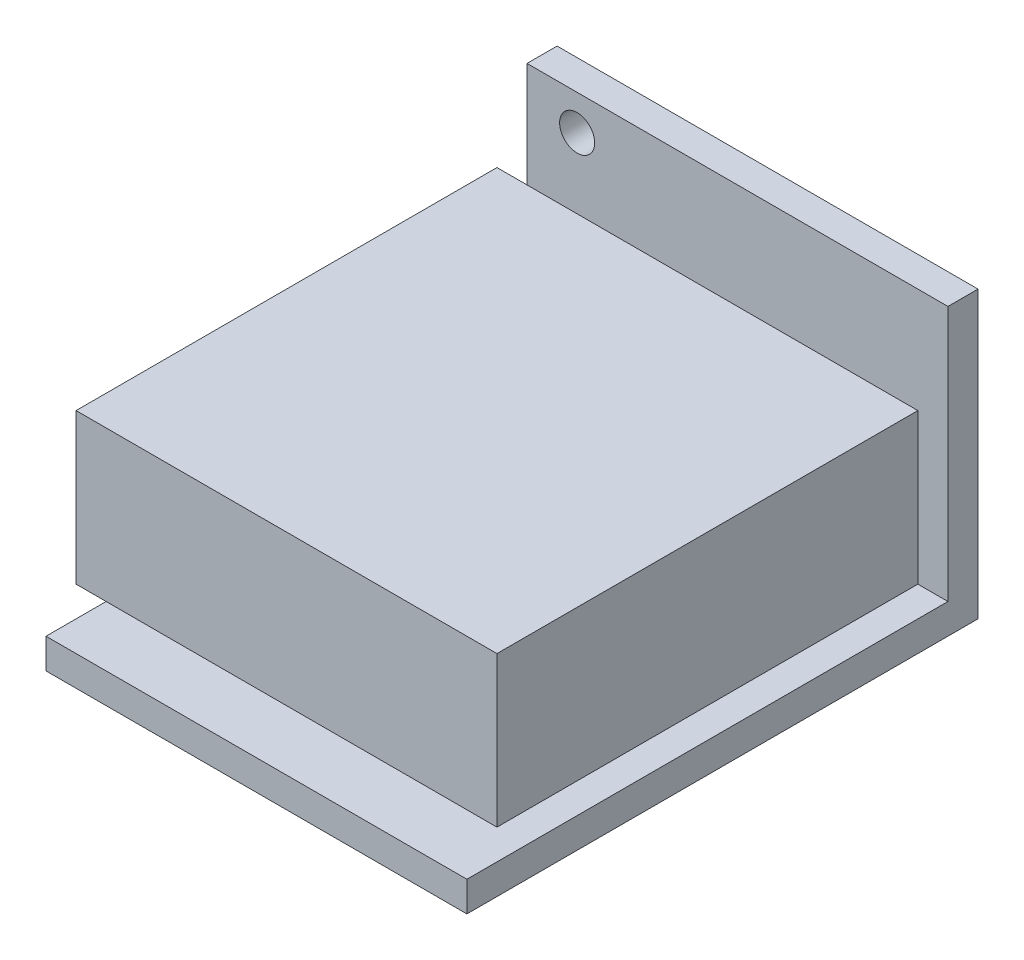
ISO-10303-21;
HEADER;
FILE_DESCRIPTION(('STEP AP214'),'2;1');
FILE_NAME('part.step','',(''),(''),'','','');
FILE_SCHEMA(('AUTOMOTIVE_DESIGN { 1 0 10303 214 1 1 1 1 }'));
ENDSEC;
DATA;
#1=APPLICATION_CONTEXT('core data for automotive mechanical design processes');
#2=APPLICATION_PROTOCOL_DEFINITION('international standard','automotive_design',2000,#1);
#3=PRODUCT_CONTEXT('',#1,'mechanical');
#4=PRODUCT('Part','Part','',(#3));
#5=PRODUCT_RELATED_PRODUCT_CATEGORY('part','',(#4));
#6=PRODUCT_DEFINITION_FORMATION('','',#4);
#7=PRODUCT_DEFINITION_CONTEXT('part definition',#1,'design');
#8=PRODUCT_DEFINITION('design','',#6,#7);
#9=PRODUCT_DEFINITION_SHAPE('','',#8);
#10=(LENGTH_UNIT() NAMED_UNIT(*) SI_UNIT(.MILLI.,.METRE.));
#11=(NAMED_UNIT(*) PLANE_ANGLE_UNIT() SI_UNIT($,.RADIAN.));
#12=(NAMED_UNIT(*) SI_UNIT($,.STERADIAN.) SOLID_ANGLE_UNIT());
#13=UNCERTAINTY_MEASURE_WITH_UNIT(LENGTH_MEASURE(1.E-05),#10,'distance_accuracy_value','');
#14=(GEOMETRIC_REPRESENTATION_CONTEXT(3) GLOBAL_UNCERTAINTY_ASSIGNED_CONTEXT((#13)) GLOBAL_UNIT_ASSIGNED_CONTEXT((#10,
#11,#12)) REPRESENTATION_CONTEXT('',''));
#15=CARTESIAN_POINT('',(0.,0.,0.));
#16=DIRECTION('',(0.,0.,1.));
#17=DIRECTION('',(1.,0.,0.));
#18=AXIS2_PLACEMENT_3D('',#15,#16,#17);
#19=CARTESIAN_POINT('',(-21.,-3.,24.));
#20=DIRECTION('',(0.,1.,0.));
#21=DIRECTION('',(0.,0.,1.));
#22=AXIS2_PLACEMENT_3D('',#19,#20,#21);
#23=PLANE('',#22);
#24=DIRECTION('',(0.,0.,1.));
#25=VECTOR('',#24,1.);
#26=CARTESIAN_POINT('',(21.,-3.,24.));
#27=LINE('',#26,#25);
#28=CARTESIAN_POINT('',(21.,-3.,-24.));
#29=VERTEX_POINT('',#28);
#30=CARTESIAN_POINT('',(21.,-3.,24.));
#31=VERTEX_POINT('',#30);
#32=EDGE_CURVE('E139',#29,#31,#27,.T.);
#33=ORIENTED_EDGE('',*,*,#32,.F.);
#34=DIRECTION('',(1.,0.,0.));
#35=VECTOR('',#34,1.);
#36=CARTESIAN_POINT('',(-21.,-3.,-24.));
#37=LINE('',#36,#35);
#38=CARTESIAN_POINT('',(-21.,-3.,-24.));
#39=VERTEX_POINT('',#38);
#40=EDGE_CURVE('E12',#39,#29,#37,.T.);
#41=ORIENTED_EDGE('',*,*,#40,.F.);
#42=DIRECTION('',(0.,0.,1.));
#43=VECTOR('',#42,1.);
#44=CARTESIAN_POINT('',(-21.,-3.,24.));
#45=LINE('',#44,#43);
#46=CARTESIAN_POINT('',(-21.,-3.,24.));
#47=VERTEX_POINT('',#46);
#48=EDGE_CURVE('E154',#39,#47,#45,.T.);
#49=ORIENTED_EDGE('',*,*,#48,.T.);
#50=DIRECTION('',(1.,0.,0.));
#51=VECTOR('',#50,1.);
#52=CARTESIAN_POINT('',(-21.,-3.,24.));
#53=LINE('',#52,#51);
#54=EDGE_CURVE('E59',#47,#31,#53,.T.);
#55=ORIENTED_EDGE('',*,*,#54,.T.);
#56=EDGE_LOOP('',(#33,#41,#49,#55));
#57=FACE_BOUND('',#56,.T.);
#58=ADVANCED_FACE('F54',(#57),#23,.T.);
#59=CARTESIAN_POINT('',(-21.,-3.,-24.));
#60=DIRECTION('',(0.,0.,1.));
#61=DIRECTION('',(0.,-1.,0.));
#62=AXIS2_PLACEMENT_3D('',#59,#60,#61);
#63=PLANE('',#62);
#64=CARTESIAN_POINT('',(-16.,19.,-24.));
#65=DIRECTION('',(0.,0.,1.));
#66=DIRECTION('',(1.,0.,0.));
#67=AXIS2_PLACEMENT_3D('',#64,#65,#66);
#68=CIRCLE('',#67,1.75);
#69=CARTESIAN_POINT('',(-14.25,19.,-24.));
#70=VERTEX_POINT('',#69);
#71=EDGE_CURVE('E200',#70,#70,#68,.T.);
#72=ORIENTED_EDGE('',*,*,#71,.F.);
#73=EDGE_LOOP('',(#72));
#74=FACE_BOUND('',#73,.T.);
#75=DIRECTION('',(0.,-1.,0.));
#76=VECTOR('',#75,1.);
#77=CARTESIAN_POINT('',(21.,-3.,-24.));
#78=LINE('',#77,#76);
#79=CARTESIAN_POINT('',(21.,22.5,-24.));
#80=VERTEX_POINT('',#79);
#81=EDGE_CURVE('E153',#80,#29,#78,.T.);
#82=ORIENTED_EDGE('',*,*,#81,.F.);
#83=DIRECTION('',(1.,0.,0.));
#84=VECTOR('',#83,1.);
#85=CARTESIAN_POINT('',(-21.,22.5,-24.));
#86=LINE('',#85,#84);
#87=CARTESIAN_POINT('',(-21.,22.5,-24.));
#88=VERTEX_POINT('',#87);
#89=EDGE_CURVE('E63',#88,#80,#86,.T.);
#90=ORIENTED_EDGE('',*,*,#89,.F.);
#91=DIRECTION('',(0.,-1.,0.));
#92=VECTOR('',#91,1.);
#93=CARTESIAN_POINT('',(-21.,-3.,-24.));
#94=LINE('',#93,#92);
#95=EDGE_CURVE('E128',#88,#39,#94,.T.);
#96=ORIENTED_EDGE('',*,*,#95,.T.);
#97=ORIENTED_EDGE('',*,*,#40,.T.);
#98=EDGE_LOOP('',(#82,#90,#96,#97));
#99=FACE_BOUND('',#98,.T.);
#100=ADVANCED_FACE('F162',(#74,#99),#63,.T.);
#101=CARTESIAN_POINT('',(-21.,22.5,-27.));
#102=DIRECTION('',(0.,1.,0.));
#103=DIRECTION('',(0.,0.,1.));
#104=AXIS2_PLACEMENT_3D('',#101,#102,#103);
#105=PLANE('',#104);
#106=DIRECTION('',(0.,0.,1.));
#107=VECTOR('',#106,1.);
#108=CARTESIAN_POINT('',(21.,22.5,-27.));
#109=LINE('',#108,#107);
#110=CARTESIAN_POINT('',(21.,22.5,-27.));
#111=VERTEX_POINT('',#110);
#112=EDGE_CURVE('E120',#111,#80,#109,.T.);
#113=ORIENTED_EDGE('',*,*,#112,.F.);
#114=DIRECTION('',(1.,0.,0.));
#115=VECTOR('',#114,1.);
#116=CARTESIAN_POINT('',(-21.,22.5,-27.));
#117=LINE('',#116,#115);
#118=CARTESIAN_POINT('',(-21.,22.5,-27.));
#119=VERTEX_POINT('',#118);
#120=EDGE_CURVE('E115',#119,#111,#117,.T.);
#121=ORIENTED_EDGE('',*,*,#120,.F.);
#122=DIRECTION('',(0.,0.,1.));
#123=VECTOR('',#122,1.);
#124=CARTESIAN_POINT('',(-21.,22.5,-27.));
#125=LINE('',#124,#123);
#126=EDGE_CURVE('E113',#119,#88,#125,.T.);
#127=ORIENTED_EDGE('',*,*,#126,.T.);
#128=ORIENTED_EDGE('',*,*,#89,.T.);
#129=EDGE_LOOP('',(#113,#121,#127,#128));
#130=FACE_BOUND('',#129,.T.);
#131=ADVANCED_FACE('F111',(#130),#105,.T.);
#132=CARTESIAN_POINT('',(-21.,22.5,-27.));
#133=DIRECTION('',(0.,0.,-1.));
#134=DIRECTION('',(-1.,0.,0.));
#135=AXIS2_PLACEMENT_3D('',#132,#133,#134);
#136=PLANE('',#135);
#137=CARTESIAN_POINT('',(-16.,19.,-27.));
#138=DIRECTION('',(0.,0.,1.));
#139=DIRECTION('',(1.,0.,0.));
#140=AXIS2_PLACEMENT_3D('',#137,#138,#139);
#141=CIRCLE('',#140,1.75);
#142=CARTESIAN_POINT('',(-14.25,19.,-27.));
#143=VERTEX_POINT('',#142);
#144=EDGE_CURVE('E145',#143,#143,#141,.T.);
#145=ORIENTED_EDGE('',*,*,#144,.T.);
#146=EDGE_LOOP('',(#145));
#147=FACE_BOUND('',#146,.T.);
#148=DIRECTION('',(0.,1.,0.));
#149=VECTOR('',#148,1.);
#150=CARTESIAN_POINT('',(21.,22.5,-27.));
#151=LINE('',#150,#149);
#152=CARTESIAN_POINT('',(21.,-6.,-27.));
#153=VERTEX_POINT('',#152);
#154=EDGE_CURVE('E147',#153,#111,#151,.T.);
#155=ORIENTED_EDGE('',*,*,#154,.F.);
#156=DIRECTION('',(1.,0.,0.));
#157=VECTOR('',#156,1.);
#158=CARTESIAN_POINT('',(-21.,-6.,-27.));
#159=LINE('',#158,#157);
#160=CARTESIAN_POINT('',(-21.,-6.,-27.));
#161=VERTEX_POINT('',#160);
#162=EDGE_CURVE('E125',#161,#153,#159,.T.);
#163=ORIENTED_EDGE('',*,*,#162,.F.);
#164=DIRECTION('',(0.,1.,0.));
#165=VECTOR('',#164,1.);
#166=CARTESIAN_POINT('',(-21.,22.5,-27.));
#167=LINE('',#166,#165);
#168=EDGE_CURVE('E126',#161,#119,#167,.T.);
#169=ORIENTED_EDGE('',*,*,#168,.T.);
#170=ORIENTED_EDGE('',*,*,#120,.T.);
#171=EDGE_LOOP('',(#155,#163,#169,#170));
#172=FACE_BOUND('',#171,.T.);
#173=ADVANCED_FACE('F135',(#147,#172),#136,.T.);
#174=CARTESIAN_POINT('',(-21.,-6.,24.));
#175=DIRECTION('',(0.,-1.,0.));
#176=DIRECTION('',(0.,0.,-1.));
#177=AXIS2_PLACEMENT_3D('',#174,#175,#176);
#178=PLANE('',#177);
#179=DIRECTION('',(0.,0.,-1.));
#180=VECTOR('',#179,1.);
#181=CARTESIAN_POINT('',(21.,-6.,24.));
#182=LINE('',#181,#180);
#183=CARTESIAN_POINT('',(21.,-6.,24.));
#184=VERTEX_POINT('',#183);
#185=EDGE_CURVE('E150',#184,#153,#182,.T.);
#186=ORIENTED_EDGE('',*,*,#185,.F.);
#187=DIRECTION('',(1.,0.,0.));
#188=VECTOR('',#187,1.);
#189=CARTESIAN_POINT('',(-21.,-6.,24.));
#190=LINE('',#189,#188);
#191=CARTESIAN_POINT('',(-21.,-6.,24.));
#192=VERTEX_POINT('',#191);
#193=EDGE_CURVE('E158',#192,#184,#190,.T.);
#194=ORIENTED_EDGE('',*,*,#193,.F.);
#195=DIRECTION('',(0.,0.,-1.));
#196=VECTOR('',#195,1.);
#197=CARTESIAN_POINT('',(-21.,-6.,24.));
#198=LINE('',#197,#196);
#199=EDGE_CURVE('E132',#192,#161,#198,.T.);
#200=ORIENTED_EDGE('',*,*,#199,.T.);
#201=ORIENTED_EDGE('',*,*,#162,.T.);
#202=EDGE_LOOP('',(#186,#194,#200,#201));
#203=FACE_BOUND('',#202,.T.);
#204=ADVANCED_FACE('F177',(#203),#178,.T.);
#205=CARTESIAN_POINT('',(-21.,-3.,24.));
#206=DIRECTION('',(0.,0.,1.));
#207=DIRECTION('',(1.,0.,0.));
#208=AXIS2_PLACEMENT_3D('',#205,#206,#207);
#209=PLANE('',#208);
#210=DIRECTION('',(0.,-1.,0.));
#211=VECTOR('',#210,1.);
#212=CARTESIAN_POINT('',(21.,-3.,24.));
#213=LINE('',#212,#211);
#214=EDGE_CURVE('E141',#31,#184,#213,.T.);
#215=ORIENTED_EDGE('',*,*,#214,.F.);
#216=ORIENTED_EDGE('',*,*,#54,.F.);
#217=DIRECTION('',(0.,-1.,0.));
#218=VECTOR('',#217,1.);
#219=CARTESIAN_POINT('',(-21.,-3.,24.));
#220=LINE('',#219,#218);
#221=EDGE_CURVE('E134',#47,#192,#220,.T.);
#222=ORIENTED_EDGE('',*,*,#221,.T.);
#223=ORIENTED_EDGE('',*,*,#193,.T.);
#224=EDGE_LOOP('',(#215,#216,#222,#223));
#225=FACE_BOUND('',#224,.T.);
#226=ADVANCED_FACE('F159',(#225),#209,.T.);
#227=CARTESIAN_POINT('',(-21.,0.,0.));
#228=DIRECTION('',(1.,0.,0.));
#229=DIRECTION('',(0.,0.,-1.));
#230=AXIS2_PLACEMENT_3D('',#227,#228,#229);
#231=PLANE('',#230);
#232=ORIENTED_EDGE('',*,*,#48,.F.);
#233=ORIENTED_EDGE('',*,*,#95,.F.);
#234=ORIENTED_EDGE('',*,*,#126,.F.);
#235=ORIENTED_EDGE('',*,*,#168,.F.);
#236=ORIENTED_EDGE('',*,*,#199,.F.);
#237=ORIENTED_EDGE('',*,*,#221,.F.);
#238=EDGE_LOOP('',(#232,#233,#234,#235,#236,#237));
#239=FACE_BOUND('',#238,.T.);
#240=ADVANCED_FACE('F127',(#239),#231,.F.);
#241=CARTESIAN_POINT('',(21.,0.,0.));
#242=DIRECTION('',(1.,0.,0.));
#243=DIRECTION('',(0.,0.,-1.));
#244=AXIS2_PLACEMENT_3D('',#241,#242,#243);
#245=PLANE('',#244);
#246=ORIENTED_EDGE('',*,*,#32,.T.);
#247=ORIENTED_EDGE('',*,*,#214,.T.);
#248=ORIENTED_EDGE('',*,*,#185,.T.);
#249=ORIENTED_EDGE('',*,*,#154,.T.);
#250=ORIENTED_EDGE('',*,*,#112,.T.);
#251=ORIENTED_EDGE('',*,*,#81,.T.);
#252=EDGE_LOOP('',(#246,#247,#248,#249,#250,#251));
#253=FACE_BOUND('',#252,.T.);
#254=ADVANCED_FACE('F165',(#253),#245,.T.);
#255=CARTESIAN_POINT('',(-16.,19.,-27.));
#256=DIRECTION('',(0.,0.,1.));
#257=DIRECTION('',(1.,0.,0.));
#258=AXIS2_PLACEMENT_3D('',#255,#256,#257);
#259=CYLINDRICAL_SURFACE('',#258,1.75);
#260=ORIENTED_EDGE('',*,*,#144,.F.);
#261=EDGE_LOOP('',(#260));
#262=FACE_BOUND('',#261,.T.);
#263=ORIENTED_EDGE('',*,*,#71,.T.);
#264=EDGE_LOOP('',(#263));
#265=FACE_BOUND('',#264,.T.);
#266=ADVANCED_FACE('F188',(#262,#265),#259,.F.);
#267=CLOSED_SHELL('',(#58,#100,#131,#173,#204,#226,#240,#254,#266));
#268=MANIFOLD_SOLID_BREP('B2',#267);
#269=CARTESIAN_POINT('',(-21.,15.,21.));
#270=DIRECTION('',(1.,0.,0.));
#271=DIRECTION('',(0.,0.,-1.));
#272=AXIS2_PLACEMENT_3D('',#269,#270,#271);
#273=PLANE('',#272);
#274=DIRECTION('',(0.,0.,1.));
#275=VECTOR('',#274,1.);
#276=CARTESIAN_POINT('',(-21.,0.,21.));
#277=LINE('',#276,#275);
#278=CARTESIAN_POINT('',(-21.,0.,-21.));
#279=VERTEX_POINT('',#278);
#280=CARTESIAN_POINT('',(-21.,0.,21.));
#281=VERTEX_POINT('',#280);
#282=EDGE_CURVE('E317',#279,#281,#277,.T.);
#283=ORIENTED_EDGE('',*,*,#282,.T.);
#284=DIRECTION('',(0.,-1.,0.));
#285=VECTOR('',#284,1.);
#286=CARTESIAN_POINT('',(-21.,15.,21.));
#287=LINE('',#286,#285);
#288=CARTESIAN_POINT('',(-21.,15.,21.));
#289=VERTEX_POINT('',#288);
#290=EDGE_CURVE('E52',#289,#281,#287,.T.);
#291=ORIENTED_EDGE('',*,*,#290,.F.);
#292=DIRECTION('',(0.,0.,1.));
#293=VECTOR('',#292,1.);
#294=CARTESIAN_POINT('',(-21.,15.,21.));
#295=LINE('',#294,#293);
#296=CARTESIAN_POINT('',(-21.,15.,-21.));
#297=VERTEX_POINT('',#296);
#298=EDGE_CURVE('E301',#297,#289,#295,.T.);
#299=ORIENTED_EDGE('',*,*,#298,.F.);
#300=DIRECTION('',(0.,-1.,0.));
#301=VECTOR('',#300,1.);
#302=CARTESIAN_POINT('',(-21.,15.,-21.));
#303=LINE('',#302,#301);
#304=EDGE_CURVE('E312',#297,#279,#303,.T.);
#305=ORIENTED_EDGE('',*,*,#304,.T.);
#306=EDGE_LOOP('',(#283,#291,#299,#305));
#307=FACE_BOUND('',#306,.T.);
#308=ADVANCED_FACE('F253',(#307),#273,.F.);
#309=CARTESIAN_POINT('',(21.,15.,21.));
#310=DIRECTION('',(0.,0.,-1.));
#311=DIRECTION('',(-1.,0.,0.));
#312=AXIS2_PLACEMENT_3D('',#309,#310,#311);
#313=PLANE('',#312);
#314=DIRECTION('',(1.,0.,0.));
#315=VECTOR('',#314,1.);
#316=CARTESIAN_POINT('',(21.,0.,21.));
#317=LINE('',#316,#315);
#318=CARTESIAN_POINT('',(21.,0.,21.));
#319=VERTEX_POINT('',#318);
#320=EDGE_CURVE('E306',#281,#319,#317,.T.);
#321=ORIENTED_EDGE('',*,*,#320,.T.);
#322=DIRECTION('',(0.,-1.,0.));
#323=VECTOR('',#322,1.);
#324=CARTESIAN_POINT('',(21.,15.,21.));
#325=LINE('',#324,#323);
#326=CARTESIAN_POINT('',(21.,15.,21.));
#327=VERTEX_POINT('',#326);
#328=EDGE_CURVE('E257',#327,#319,#325,.T.);
#329=ORIENTED_EDGE('',*,*,#328,.F.);
#330=DIRECTION('',(1.,0.,0.));
#331=VECTOR('',#330,1.);
#332=CARTESIAN_POINT('',(21.,15.,21.));
#333=LINE('',#332,#331);
#334=EDGE_CURVE('E297',#289,#327,#333,.T.);
#335=ORIENTED_EDGE('',*,*,#334,.F.);
#336=ORIENTED_EDGE('',*,*,#290,.T.);
#337=EDGE_LOOP('',(#321,#329,#335,#336));
#338=FACE_BOUND('',#337,.T.);
#339=ADVANCED_FACE('F307',(#338),#313,.F.);
#340=CARTESIAN_POINT('',(21.,15.,21.));
#341=DIRECTION('',(-1.,0.,0.));
#342=DIRECTION('',(0.,0.,1.));
#343=AXIS2_PLACEMENT_3D('',#340,#341,#342);
#344=PLANE('',#343);
#345=DIRECTION('',(0.,0.,-1.));
#346=VECTOR('',#345,1.);
#347=CARTESIAN_POINT('',(21.,0.,21.));
#348=LINE('',#347,#346);
#349=CARTESIAN_POINT('',(21.,0.,-21.));
#350=VERTEX_POINT('',#349);
#351=EDGE_CURVE('E284',#319,#350,#348,.T.);
#352=ORIENTED_EDGE('',*,*,#351,.T.);
#353=DIRECTION('',(0.,-1.,0.));
#354=VECTOR('',#353,1.);
#355=CARTESIAN_POINT('',(21.,15.,-21.));
#356=LINE('',#355,#354);
#357=CARTESIAN_POINT('',(21.,15.,-21.));
#358=VERTEX_POINT('',#357);
#359=EDGE_CURVE('E309',#358,#350,#356,.T.);
#360=ORIENTED_EDGE('',*,*,#359,.F.);
#361=DIRECTION('',(0.,0.,-1.));
#362=VECTOR('',#361,1.);
#363=CARTESIAN_POINT('',(21.,15.,21.));
#364=LINE('',#363,#362);
#365=EDGE_CURVE('E303',#327,#358,#364,.T.);
#366=ORIENTED_EDGE('',*,*,#365,.F.);
#367=ORIENTED_EDGE('',*,*,#328,.T.);
#368=EDGE_LOOP('',(#352,#360,#366,#367));
#369=FACE_BOUND('',#368,.T.);
#370=ADVANCED_FACE('F313',(#369),#344,.F.);
#371=CARTESIAN_POINT('',(21.,15.,-21.));
#372=DIRECTION('',(0.,0.,1.));
#373=DIRECTION('',(1.,0.,0.));
#374=AXIS2_PLACEMENT_3D('',#371,#372,#373);
#375=PLANE('',#374);
#376=DIRECTION('',(-1.,0.,0.));
#377=VECTOR('',#376,1.);
#378=CARTESIAN_POINT('',(21.,0.,-21.));
#379=LINE('',#378,#377);
#380=EDGE_CURVE('E292',#350,#279,#379,.T.);
#381=ORIENTED_EDGE('',*,*,#380,.T.);
#382=ORIENTED_EDGE('',*,*,#304,.F.);
#383=DIRECTION('',(-1.,0.,0.));
#384=VECTOR('',#383,1.);
#385=CARTESIAN_POINT('',(21.,15.,-21.));
#386=LINE('',#385,#384);
#387=EDGE_CURVE('E268',#358,#297,#386,.T.);
#388=ORIENTED_EDGE('',*,*,#387,.F.);
#389=ORIENTED_EDGE('',*,*,#359,.T.);
#390=EDGE_LOOP('',(#381,#382,#388,#389));
#391=FACE_BOUND('',#390,.T.);
#392=ADVANCED_FACE('F335',(#391),#375,.F.);
#393=CARTESIAN_POINT('',(0.,15.,0.));
#394=DIRECTION('',(0.,1.,0.));
#395=DIRECTION('',(0.,0.,1.));
#396=AXIS2_PLACEMENT_3D('',#393,#394,#395);
#397=PLANE('',#396);
#398=ORIENTED_EDGE('',*,*,#298,.T.);
#399=ORIENTED_EDGE('',*,*,#334,.T.);
#400=ORIENTED_EDGE('',*,*,#365,.T.);
#401=ORIENTED_EDGE('',*,*,#387,.T.);
#402=EDGE_LOOP('',(#398,#399,#400,#401));
#403=FACE_BOUND('',#402,.T.);
#404=ADVANCED_FACE('F298',(#403),#397,.T.);
#405=CARTESIAN_POINT('',(0.,0.,0.));
#406=DIRECTION('',(0.,1.,0.));
#407=DIRECTION('',(0.,0.,1.));
#408=AXIS2_PLACEMENT_3D('',#405,#406,#407);
#409=PLANE('',#408);
#410=ORIENTED_EDGE('',*,*,#282,.F.);
#411=ORIENTED_EDGE('',*,*,#380,.F.);
#412=ORIENTED_EDGE('',*,*,#351,.F.);
#413=ORIENTED_EDGE('',*,*,#320,.F.);
#414=EDGE_LOOP('',(#410,#411,#412,#413));
#415=FACE_BOUND('',#414,.T.);
#416=ADVANCED_FACE('F333',(#415),#409,.F.);
#417=CLOSED_SHELL('',(#308,#339,#370,#392,#404,#416));
#418=MANIFOLD_SOLID_BREP('B6',#417);
#419=ADVANCED_BREP_SHAPE_REPRESENTATION('',(#18,#268,#418),#14);
#420=SHAPE_DEFINITION_REPRESENTATION(#9,#419);
ENDSEC;
END-ISO-10303-21;
